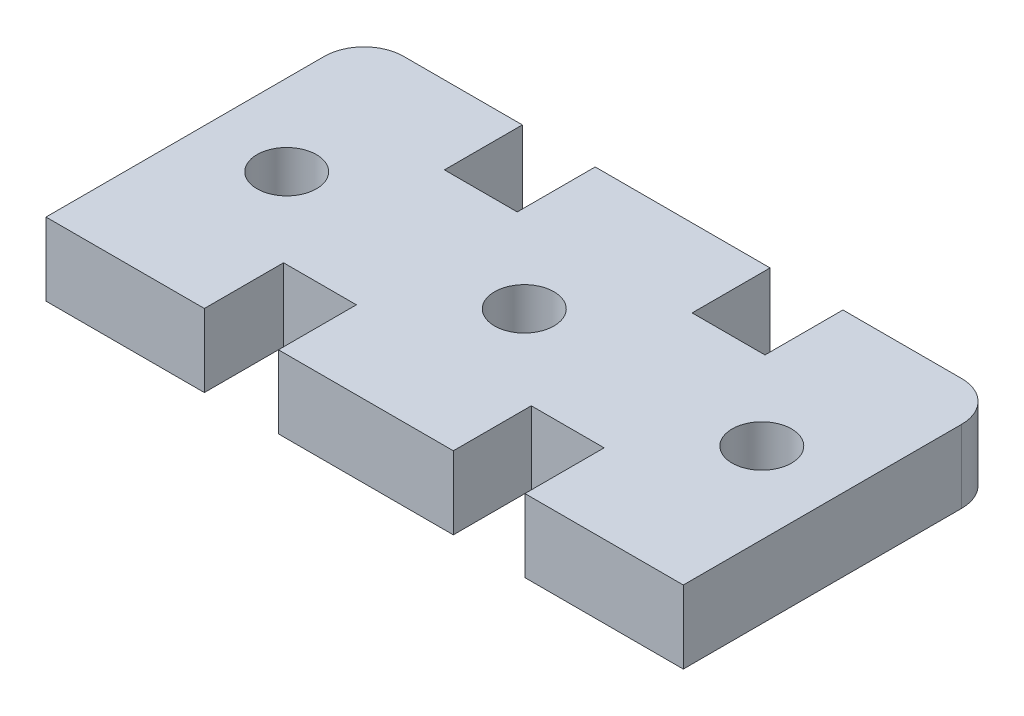
ISO-10303-21;
HEADER;
FILE_DESCRIPTION(('STEP AP214'),'2;1');
FILE_NAME('part.step','',(''),(''),'','','');
FILE_SCHEMA(('AUTOMOTIVE_DESIGN { 1 0 10303 214 1 1 1 1 }'));
ENDSEC;
DATA;
#1=APPLICATION_CONTEXT('core data for automotive mechanical design processes');
#2=APPLICATION_PROTOCOL_DEFINITION('international standard','automotive_design',2000,#1);
#3=PRODUCT_CONTEXT('',#1,'mechanical');
#4=PRODUCT('Part','Part','',(#3));
#5=PRODUCT_RELATED_PRODUCT_CATEGORY('part','',(#4));
#6=PRODUCT_DEFINITION_FORMATION('','',#4);
#7=PRODUCT_DEFINITION_CONTEXT('part definition',#1,'design');
#8=PRODUCT_DEFINITION('design','',#6,#7);
#9=PRODUCT_DEFINITION_SHAPE('','',#8);
#10=(LENGTH_UNIT() NAMED_UNIT(*) SI_UNIT(.MILLI.,.METRE.));
#11=(NAMED_UNIT(*) PLANE_ANGLE_UNIT() SI_UNIT($,.RADIAN.));
#12=(NAMED_UNIT(*) SI_UNIT($,.STERADIAN.) SOLID_ANGLE_UNIT());
#13=UNCERTAINTY_MEASURE_WITH_UNIT(LENGTH_MEASURE(1.E-05),#10,'distance_accuracy_value','');
#14=(GEOMETRIC_REPRESENTATION_CONTEXT(3) GLOBAL_UNCERTAINTY_ASSIGNED_CONTEXT((#13)) GLOBAL_UNIT_ASSIGNED_CONTEXT((#10,
#11,#12)) REPRESENTATION_CONTEXT('',''));
#15=CARTESIAN_POINT('',(0.,0.,0.));
#16=DIRECTION('',(0.,0.,1.));
#17=DIRECTION('',(1.,0.,0.));
#18=AXIS2_PLACEMENT_3D('',#15,#16,#17);
#19=CARTESIAN_POINT('',(-7.012,5.842,-6.44999999999999));
#20=DIRECTION('',(1.,0.,0.));
#21=DIRECTION('',(0.,0.,-1.));
#22=AXIS2_PLACEMENT_3D('',#19,#20,#21);
#23=PLANE('',#22);
#24=DIRECTION('',(0.,0.,1.));
#25=VECTOR('',#24,1.);
#26=CARTESIAN_POINT('',(-7.012,0.,-6.44999999999999));
#27=LINE('',#26,#25);
#28=CARTESIAN_POINT('',(-7.012,0.,-12.7));
#29=VERTEX_POINT('',#28);
#30=CARTESIAN_POINT('',(-7.012,0.,-6.44999999999999));
#31=VERTEX_POINT('',#30);
#32=EDGE_CURVE('E242',#29,#31,#27,.T.);
#33=ORIENTED_EDGE('',*,*,#32,.T.);
#34=DIRECTION('',(0.,-1.,0.));
#35=VECTOR('',#34,1.);
#36=CARTESIAN_POINT('',(-7.012,5.842,-6.44999999999999));
#37=LINE('',#36,#35);
#38=CARTESIAN_POINT('',(-7.012,5.842,-6.44999999999999));
#39=VERTEX_POINT('',#38);
#40=EDGE_CURVE('E352',#39,#31,#37,.T.);
#41=ORIENTED_EDGE('',*,*,#40,.F.);
#42=DIRECTION('',(0.,0.,1.));
#43=VECTOR('',#42,1.);
#44=CARTESIAN_POINT('',(-7.012,5.842,-6.44999999999999));
#45=LINE('',#44,#43);
#46=CARTESIAN_POINT('',(-7.012,5.842,-12.7));
#47=VERTEX_POINT('',#46);
#48=EDGE_CURVE('E245',#47,#39,#45,.T.);
#49=ORIENTED_EDGE('',*,*,#48,.F.);
#50=DIRECTION('',(0.,-1.,0.));
#51=VECTOR('',#50,1.);
#52=CARTESIAN_POINT('',(-7.012,5.842,-12.7));
#53=LINE('',#52,#51);
#54=EDGE_CURVE('E279',#47,#29,#53,.T.);
#55=ORIENTED_EDGE('',*,*,#54,.T.);
#56=EDGE_LOOP('',(#33,#41,#49,#55));
#57=FACE_BOUND('',#56,.T.);
#58=ADVANCED_FACE('F35',(#57),#23,.F.);
#59=CARTESIAN_POINT('',(-12.854,5.842,-6.44999999999999));
#60=DIRECTION('',(0.,0.,1.));
#61=DIRECTION('',(1.,0.,0.));
#62=AXIS2_PLACEMENT_3D('',#59,#60,#61);
#63=PLANE('',#62);
#64=DIRECTION('',(-1.,0.,0.));
#65=VECTOR('',#64,1.);
#66=CARTESIAN_POINT('',(-12.854,0.,-6.44999999999999));
#67=LINE('',#66,#65);
#68=CARTESIAN_POINT('',(-12.854,0.,-6.44999999999999));
#69=VERTEX_POINT('',#68);
#70=EDGE_CURVE('E282',#31,#69,#67,.T.);
#71=ORIENTED_EDGE('',*,*,#70,.T.);
#72=DIRECTION('',(0.,-1.,0.));
#73=VECTOR('',#72,1.);
#74=CARTESIAN_POINT('',(-12.854,5.842,-6.44999999999999));
#75=LINE('',#74,#73);
#76=CARTESIAN_POINT('',(-12.854,5.842,-6.44999999999999));
#77=VERTEX_POINT('',#76);
#78=EDGE_CURVE('E349',#77,#69,#75,.T.);
#79=ORIENTED_EDGE('',*,*,#78,.F.);
#80=DIRECTION('',(-1.,0.,0.));
#81=VECTOR('',#80,1.);
#82=CARTESIAN_POINT('',(-12.854,5.842,-6.44999999999999));
#83=LINE('',#82,#81);
#84=EDGE_CURVE('E248',#39,#77,#83,.T.);
#85=ORIENTED_EDGE('',*,*,#84,.F.);
#86=ORIENTED_EDGE('',*,*,#40,.T.);
#87=EDGE_LOOP('',(#71,#79,#85,#86));
#88=FACE_BOUND('',#87,.T.);
#89=ADVANCED_FACE('F447',(#88),#63,.F.);
#90=CARTESIAN_POINT('',(-12.854,5.842,-6.44999999999999));
#91=DIRECTION('',(-1.,0.,0.));
#92=DIRECTION('',(0.,0.,1.));
#93=AXIS2_PLACEMENT_3D('',#90,#91,#92);
#94=PLANE('',#93);
#95=DIRECTION('',(0.,0.,-1.));
#96=VECTOR('',#95,1.);
#97=CARTESIAN_POINT('',(-12.854,0.,-6.44999999999999));
#98=LINE('',#97,#96);
#99=CARTESIAN_POINT('',(-12.854,0.,-12.7));
#100=VERTEX_POINT('',#99);
#101=EDGE_CURVE('E284',#69,#100,#98,.T.);
#102=ORIENTED_EDGE('',*,*,#101,.T.);
#103=DIRECTION('',(0.,-1.,0.));
#104=VECTOR('',#103,1.);
#105=CARTESIAN_POINT('',(-12.854,5.842,-12.7));
#106=LINE('',#105,#104);
#107=CARTESIAN_POINT('',(-12.854,5.842,-12.7));
#108=VERTEX_POINT('',#107);
#109=EDGE_CURVE('E346',#108,#100,#106,.T.);
#110=ORIENTED_EDGE('',*,*,#109,.F.);
#111=DIRECTION('',(0.,0.,-1.));
#112=VECTOR('',#111,1.);
#113=CARTESIAN_POINT('',(-12.854,5.842,-6.44999999999999));
#114=LINE('',#113,#112);
#115=EDGE_CURVE('E251',#77,#108,#114,.T.);
#116=ORIENTED_EDGE('',*,*,#115,.F.);
#117=ORIENTED_EDGE('',*,*,#78,.T.);
#118=EDGE_LOOP('',(#102,#110,#116,#117));
#119=FACE_BOUND('',#118,.T.);
#120=ADVANCED_FACE('F450',(#119),#94,.F.);
#121=CARTESIAN_POINT('',(-25.554,5.842,-12.7));
#122=DIRECTION('',(0.,0.,1.));
#123=DIRECTION('',(1.,0.,0.));
#124=AXIS2_PLACEMENT_3D('',#121,#122,#123);
#125=PLANE('',#124);
#126=DIRECTION('',(-1.,0.,0.));
#127=VECTOR('',#126,1.);
#128=CARTESIAN_POINT('',(-25.554,0.,-12.7));
#129=LINE('',#128,#127);
#130=CARTESIAN_POINT('',(-22.379,0.,-12.7));
#131=VERTEX_POINT('',#130);
#132=EDGE_CURVE('E286',#100,#131,#129,.T.);
#133=ORIENTED_EDGE('',*,*,#132,.T.);
#134=DIRECTION('',(0.,-1.,0.));
#135=VECTOR('',#134,1.);
#136=CARTESIAN_POINT('',(-22.379,5.842,-12.7));
#137=LINE('',#136,#135);
#138=CARTESIAN_POINT('',(-22.379,5.842,-12.7));
#139=VERTEX_POINT('',#138);
#140=EDGE_CURVE('E11',#131,#139,#137,.F.);
#141=ORIENTED_EDGE('',*,*,#140,.T.);
#142=DIRECTION('',(-1.,0.,0.));
#143=VECTOR('',#142,1.);
#144=CARTESIAN_POINT('',(-25.554,5.842,-12.7));
#145=LINE('',#144,#143);
#146=EDGE_CURVE('E253',#108,#139,#145,.T.);
#147=ORIENTED_EDGE('',*,*,#146,.F.);
#148=ORIENTED_EDGE('',*,*,#109,.T.);
#149=EDGE_LOOP('',(#133,#141,#147,#148));
#150=FACE_BOUND('',#149,.T.);
#151=ADVANCED_FACE('F451',(#150),#125,.F.);
#152=CARTESIAN_POINT('',(-25.554,5.842,12.7));
#153=DIRECTION('',(1.,0.,0.));
#154=DIRECTION('',(0.,0.,-1.));
#155=AXIS2_PLACEMENT_3D('',#152,#153,#154);
#156=PLANE('',#155);
#157=DIRECTION('',(0.,0.,1.));
#158=VECTOR('',#157,1.);
#159=CARTESIAN_POINT('',(-25.554,5.842,12.7));
#160=LINE('',#159,#158);
#161=CARTESIAN_POINT('',(-25.554,5.842,-9.52499999999998));
#162=VERTEX_POINT('',#161);
#163=CARTESIAN_POINT('',(-25.554,5.842,12.8));
#164=VERTEX_POINT('',#163);
#165=EDGE_CURVE('E255',#162,#164,#160,.T.);
#166=ORIENTED_EDGE('',*,*,#165,.F.);
#167=DIRECTION('',(0.,-1.,0.));
#168=VECTOR('',#167,1.);
#169=CARTESIAN_POINT('',(-25.554,5.842,-9.52499999999998));
#170=LINE('',#169,#168);
#171=CARTESIAN_POINT('',(-25.554,0.,-9.52499999999998));
#172=VERTEX_POINT('',#171);
#173=EDGE_CURVE('E43',#162,#172,#170,.T.);
#174=ORIENTED_EDGE('',*,*,#173,.T.);
#175=DIRECTION('',(0.,0.,1.));
#176=VECTOR('',#175,1.);
#177=CARTESIAN_POINT('',(-25.554,0.,12.7));
#178=LINE('',#177,#176);
#179=CARTESIAN_POINT('',(-25.554,0.,12.8));
#180=VERTEX_POINT('',#179);
#181=EDGE_CURVE('E288',#172,#180,#178,.T.);
#182=ORIENTED_EDGE('',*,*,#181,.T.);
#183=DIRECTION('',(0.,1.,0.));
#184=VECTOR('',#183,1.);
#185=CARTESIAN_POINT('',(-25.554,-12.7003936946852,12.8));
#186=LINE('',#185,#184);
#187=EDGE_CURVE('E217',#180,#164,#186,.T.);
#188=ORIENTED_EDGE('',*,*,#187,.T.);
#189=EDGE_LOOP('',(#166,#174,#182,#188));
#190=FACE_BOUND('',#189,.T.);
#191=ADVANCED_FACE('F370',(#190),#156,.F.);
#192=CARTESIAN_POINT('',(-12.854,5.842,12.7));
#193=DIRECTION('',(-1.,0.,0.));
#194=DIRECTION('',(0.,0.,1.));
#195=AXIS2_PLACEMENT_3D('',#192,#193,#194);
#196=PLANE('',#195);
#197=DIRECTION('',(0.,0.,-1.));
#198=VECTOR('',#197,1.);
#199=CARTESIAN_POINT('',(-12.854,0.,12.7));
#200=LINE('',#199,#198);
#201=CARTESIAN_POINT('',(-12.854,0.,12.8));
#202=VERTEX_POINT('',#201);
#203=CARTESIAN_POINT('',(-12.854,0.,6.45000000000001));
#204=VERTEX_POINT('',#203);
#205=EDGE_CURVE('E290',#202,#204,#200,.T.);
#206=ORIENTED_EDGE('',*,*,#205,.T.);
#207=DIRECTION('',(0.,-1.,0.));
#208=VECTOR('',#207,1.);
#209=CARTESIAN_POINT('',(-12.854,5.842,6.45000000000001));
#210=LINE('',#209,#208);
#211=CARTESIAN_POINT('',(-12.854,5.842,6.45000000000001));
#212=VERTEX_POINT('',#211);
#213=EDGE_CURVE('E343',#212,#204,#210,.T.);
#214=ORIENTED_EDGE('',*,*,#213,.F.);
#215=DIRECTION('',(0.,0.,-1.));
#216=VECTOR('',#215,1.);
#217=CARTESIAN_POINT('',(-12.854,5.842,12.7));
#218=LINE('',#217,#216);
#219=CARTESIAN_POINT('',(-12.854,5.842,12.8));
#220=VERTEX_POINT('',#219);
#221=EDGE_CURVE('E257',#220,#212,#218,.T.);
#222=ORIENTED_EDGE('',*,*,#221,.F.);
#223=DIRECTION('',(0.,1.,0.));
#224=VECTOR('',#223,1.);
#225=CARTESIAN_POINT('',(-12.854,-12.7003936946852,12.8));
#226=LINE('',#225,#224);
#227=EDGE_CURVE('E218',#202,#220,#226,.T.);
#228=ORIENTED_EDGE('',*,*,#227,.F.);
#229=EDGE_LOOP('',(#206,#214,#222,#228));
#230=FACE_BOUND('',#229,.T.);
#231=ADVANCED_FACE('F387',(#230),#196,.F.);
#232=CARTESIAN_POINT('',(-12.854,5.842,6.45000000000001));
#233=DIRECTION('',(0.,0.,-1.));
#234=DIRECTION('',(-1.,0.,0.));
#235=AXIS2_PLACEMENT_3D('',#232,#233,#234);
#236=PLANE('',#235);
#237=DIRECTION('',(1.,0.,0.));
#238=VECTOR('',#237,1.);
#239=CARTESIAN_POINT('',(-12.854,0.,6.45000000000001));
#240=LINE('',#239,#238);
#241=CARTESIAN_POINT('',(-7.012,0.,6.45000000000001));
#242=VERTEX_POINT('',#241);
#243=EDGE_CURVE('E292',#204,#242,#240,.T.);
#244=ORIENTED_EDGE('',*,*,#243,.T.);
#245=DIRECTION('',(0.,-1.,0.));
#246=VECTOR('',#245,1.);
#247=CARTESIAN_POINT('',(-7.012,5.842,6.45000000000001));
#248=LINE('',#247,#246);
#249=CARTESIAN_POINT('',(-7.012,5.842,6.45000000000001));
#250=VERTEX_POINT('',#249);
#251=EDGE_CURVE('E340',#250,#242,#248,.T.);
#252=ORIENTED_EDGE('',*,*,#251,.F.);
#253=DIRECTION('',(1.,0.,0.));
#254=VECTOR('',#253,1.);
#255=CARTESIAN_POINT('',(-12.854,5.842,6.45000000000001));
#256=LINE('',#255,#254);
#257=EDGE_CURVE('E259',#212,#250,#256,.T.);
#258=ORIENTED_EDGE('',*,*,#257,.F.);
#259=ORIENTED_EDGE('',*,*,#213,.T.);
#260=EDGE_LOOP('',(#244,#252,#258,#259));
#261=FACE_BOUND('',#260,.T.);
#262=ADVANCED_FACE('F389',(#261),#236,.F.);
#263=CARTESIAN_POINT('',(-7.012,5.842,12.7));
#264=DIRECTION('',(1.,0.,0.));
#265=DIRECTION('',(0.,0.,-1.));
#266=AXIS2_PLACEMENT_3D('',#263,#264,#265);
#267=PLANE('',#266);
#268=DIRECTION('',(0.,0.,1.));
#269=VECTOR('',#268,1.);
#270=CARTESIAN_POINT('',(-7.012,0.,12.7));
#271=LINE('',#270,#269);
#272=CARTESIAN_POINT('',(-7.012,0.,12.7));
#273=VERTEX_POINT('',#272);
#274=EDGE_CURVE('E294',#242,#273,#271,.T.);
#275=ORIENTED_EDGE('',*,*,#274,.T.);
#276=DIRECTION('',(0.,-1.,0.));
#277=VECTOR('',#276,1.);
#278=CARTESIAN_POINT('',(-7.012,5.842,12.7));
#279=LINE('',#278,#277);
#280=CARTESIAN_POINT('',(-7.012,5.842,12.7));
#281=VERTEX_POINT('',#280);
#282=EDGE_CURVE('E337',#281,#273,#279,.T.);
#283=ORIENTED_EDGE('',*,*,#282,.F.);
#284=DIRECTION('',(0.,0.,1.));
#285=VECTOR('',#284,1.);
#286=CARTESIAN_POINT('',(-7.012,5.842,12.7));
#287=LINE('',#286,#285);
#288=EDGE_CURVE('E261',#250,#281,#287,.T.);
#289=ORIENTED_EDGE('',*,*,#288,.F.);
#290=ORIENTED_EDGE('',*,*,#251,.T.);
#291=EDGE_LOOP('',(#275,#283,#289,#290));
#292=FACE_BOUND('',#291,.T.);
#293=ADVANCED_FACE('F394',(#292),#267,.F.);
#294=CARTESIAN_POINT('',(7.012,5.842,12.7));
#295=DIRECTION('',(0.,0.,-1.));
#296=DIRECTION('',(-1.,0.,0.));
#297=AXIS2_PLACEMENT_3D('',#294,#295,#296);
#298=PLANE('',#297);
#299=DIRECTION('',(1.,0.,0.));
#300=VECTOR('',#299,1.);
#301=CARTESIAN_POINT('',(7.012,0.,12.7));
#302=LINE('',#301,#300);
#303=CARTESIAN_POINT('',(7.012,0.,12.7));
#304=VERTEX_POINT('',#303);
#305=EDGE_CURVE('E296',#273,#304,#302,.T.);
#306=ORIENTED_EDGE('',*,*,#305,.T.);
#307=DIRECTION('',(0.,-1.,0.));
#308=VECTOR('',#307,1.);
#309=CARTESIAN_POINT('',(7.012,5.842,12.7));
#310=LINE('',#309,#308);
#311=CARTESIAN_POINT('',(7.012,5.842,12.7));
#312=VERTEX_POINT('',#311);
#313=EDGE_CURVE('E334',#312,#304,#310,.T.);
#314=ORIENTED_EDGE('',*,*,#313,.F.);
#315=DIRECTION('',(1.,0.,0.));
#316=VECTOR('',#315,1.);
#317=CARTESIAN_POINT('',(7.012,5.842,12.7));
#318=LINE('',#317,#316);
#319=EDGE_CURVE('E263',#281,#312,#318,.T.);
#320=ORIENTED_EDGE('',*,*,#319,.F.);
#321=ORIENTED_EDGE('',*,*,#282,.T.);
#322=EDGE_LOOP('',(#306,#314,#320,#321));
#323=FACE_BOUND('',#322,.T.);
#324=ADVANCED_FACE('F400',(#323),#298,.F.);
#325=CARTESIAN_POINT('',(7.012,5.842,12.7));
#326=DIRECTION('',(-1.,0.,0.));
#327=DIRECTION('',(0.,0.,1.));
#328=AXIS2_PLACEMENT_3D('',#325,#326,#327);
#329=PLANE('',#328);
#330=DIRECTION('',(0.,0.,-1.));
#331=VECTOR('',#330,1.);
#332=CARTESIAN_POINT('',(7.012,0.,12.7));
#333=LINE('',#332,#331);
#334=CARTESIAN_POINT('',(7.012,0.,6.45000000000001));
#335=VERTEX_POINT('',#334);
#336=EDGE_CURVE('E298',#304,#335,#333,.T.);
#337=ORIENTED_EDGE('',*,*,#336,.T.);
#338=DIRECTION('',(0.,-1.,0.));
#339=VECTOR('',#338,1.);
#340=CARTESIAN_POINT('',(7.012,5.842,6.45000000000001));
#341=LINE('',#340,#339);
#342=CARTESIAN_POINT('',(7.012,5.842,6.45000000000001));
#343=VERTEX_POINT('',#342);
#344=EDGE_CURVE('E331',#343,#335,#341,.T.);
#345=ORIENTED_EDGE('',*,*,#344,.F.);
#346=DIRECTION('',(0.,0.,-1.));
#347=VECTOR('',#346,1.);
#348=CARTESIAN_POINT('',(7.012,5.842,12.7));
#349=LINE('',#348,#347);
#350=EDGE_CURVE('E265',#312,#343,#349,.T.);
#351=ORIENTED_EDGE('',*,*,#350,.F.);
#352=ORIENTED_EDGE('',*,*,#313,.T.);
#353=EDGE_LOOP('',(#337,#345,#351,#352));
#354=FACE_BOUND('',#353,.T.);
#355=ADVANCED_FACE('F404',(#354),#329,.F.);
#356=CARTESIAN_POINT('',(12.854,5.842,6.45000000000001));
#357=DIRECTION('',(0.,0.,-1.));
#358=DIRECTION('',(-1.,0.,0.));
#359=AXIS2_PLACEMENT_3D('',#356,#357,#358);
#360=PLANE('',#359);
#361=DIRECTION('',(1.,0.,0.));
#362=VECTOR('',#361,1.);
#363=CARTESIAN_POINT('',(12.854,0.,6.45000000000001));
#364=LINE('',#363,#362);
#365=CARTESIAN_POINT('',(12.854,0.,6.45000000000001));
#366=VERTEX_POINT('',#365);
#367=EDGE_CURVE('E300',#335,#366,#364,.T.);
#368=ORIENTED_EDGE('',*,*,#367,.T.);
#369=DIRECTION('',(0.,-1.,0.));
#370=VECTOR('',#369,1.);
#371=CARTESIAN_POINT('',(12.854,5.842,6.45000000000001));
#372=LINE('',#371,#370);
#373=CARTESIAN_POINT('',(12.854,5.842,6.45000000000001));
#374=VERTEX_POINT('',#373);
#375=EDGE_CURVE('E329',#374,#366,#372,.T.);
#376=ORIENTED_EDGE('',*,*,#375,.F.);
#377=DIRECTION('',(1.,0.,0.));
#378=VECTOR('',#377,1.);
#379=CARTESIAN_POINT('',(12.854,5.842,6.45000000000001));
#380=LINE('',#379,#378);
#381=EDGE_CURVE('E190',#343,#374,#380,.T.);
#382=ORIENTED_EDGE('',*,*,#381,.F.);
#383=ORIENTED_EDGE('',*,*,#344,.T.);
#384=EDGE_LOOP('',(#368,#376,#382,#383));
#385=FACE_BOUND('',#384,.T.);
#386=ADVANCED_FACE('F407',(#385),#360,.F.);
#387=CARTESIAN_POINT('',(12.854,5.842,12.7));
#388=DIRECTION('',(1.,0.,0.));
#389=DIRECTION('',(0.,0.,-1.));
#390=AXIS2_PLACEMENT_3D('',#387,#388,#389);
#391=PLANE('',#390);
#392=DIRECTION('',(0.,0.,1.));
#393=VECTOR('',#392,1.);
#394=CARTESIAN_POINT('',(12.854,0.,12.7));
#395=LINE('',#394,#393);
#396=CARTESIAN_POINT('',(12.854,0.,12.8));
#397=VERTEX_POINT('',#396);
#398=EDGE_CURVE('E200',#366,#397,#395,.T.);
#399=ORIENTED_EDGE('',*,*,#398,.T.);
#400=DIRECTION('',(0.,1.,0.));
#401=VECTOR('',#400,1.);
#402=CARTESIAN_POINT('',(12.854,-12.7003936946852,12.8));
#403=LINE('',#402,#401);
#404=CARTESIAN_POINT('',(12.854,5.842,12.8));
#405=VERTEX_POINT('',#404);
#406=EDGE_CURVE('E197',#397,#405,#403,.T.);
#407=ORIENTED_EDGE('',*,*,#406,.T.);
#408=DIRECTION('',(0.,0.,1.));
#409=VECTOR('',#408,1.);
#410=CARTESIAN_POINT('',(12.854,5.842,12.7));
#411=LINE('',#410,#409);
#412=EDGE_CURVE('E183',#374,#405,#411,.T.);
#413=ORIENTED_EDGE('',*,*,#412,.F.);
#414=ORIENTED_EDGE('',*,*,#375,.T.);
#415=EDGE_LOOP('',(#399,#407,#413,#414));
#416=FACE_BOUND('',#415,.T.);
#417=ADVANCED_FACE('F198',(#416),#391,.F.);
#418=CARTESIAN_POINT('',(25.554,5.842,12.7));
#419=DIRECTION('',(-1.,0.,0.));
#420=DIRECTION('',(0.,0.,1.));
#421=AXIS2_PLACEMENT_3D('',#418,#419,#420);
#422=PLANE('',#421);
#423=DIRECTION('',(0.,0.,-1.));
#424=VECTOR('',#423,1.);
#425=CARTESIAN_POINT('',(25.554,0.,12.7));
#426=LINE('',#425,#424);
#427=CARTESIAN_POINT('',(25.554,0.,12.8));
#428=VERTEX_POINT('',#427);
#429=CARTESIAN_POINT('',(25.554,0.,-9.52499999999998));
#430=VERTEX_POINT('',#429);
#431=EDGE_CURVE('E303',#428,#430,#426,.T.);
#432=ORIENTED_EDGE('',*,*,#431,.T.);
#433=DIRECTION('',(0.,-1.,0.));
#434=VECTOR('',#433,1.);
#435=CARTESIAN_POINT('',(25.554,5.842,-9.52499999999998));
#436=LINE('',#435,#434);
#437=CARTESIAN_POINT('',(25.554,5.842,-9.52499999999998));
#438=VERTEX_POINT('',#437);
#439=EDGE_CURVE('E362',#430,#438,#436,.F.);
#440=ORIENTED_EDGE('',*,*,#439,.T.);
#441=DIRECTION('',(0.,0.,-1.));
#442=VECTOR('',#441,1.);
#443=CARTESIAN_POINT('',(25.554,5.842,12.7));
#444=LINE('',#443,#442);
#445=CARTESIAN_POINT('',(25.554,5.842,12.8));
#446=VERTEX_POINT('',#445);
#447=EDGE_CURVE('E194',#446,#438,#444,.T.);
#448=ORIENTED_EDGE('',*,*,#447,.F.);
#449=DIRECTION('',(0.,1.,0.));
#450=VECTOR('',#449,1.);
#451=CARTESIAN_POINT('',(25.554,-12.7003936946852,12.8));
#452=LINE('',#451,#450);
#453=EDGE_CURVE('E204',#428,#446,#452,.T.);
#454=ORIENTED_EDGE('',*,*,#453,.F.);
#455=EDGE_LOOP('',(#432,#440,#448,#454));
#456=FACE_BOUND('',#455,.T.);
#457=ADVANCED_FACE('F409',(#456),#422,.F.);
#458=CARTESIAN_POINT('',(25.554,5.842,-12.7));
#459=DIRECTION('',(0.,0.,1.));
#460=DIRECTION('',(1.,0.,0.));
#461=AXIS2_PLACEMENT_3D('',#458,#459,#460);
#462=PLANE('',#461);
#463=DIRECTION('',(-1.,0.,0.));
#464=VECTOR('',#463,1.);
#465=CARTESIAN_POINT('',(25.554,5.842,-12.7));
#466=LINE('',#465,#464);
#467=CARTESIAN_POINT('',(22.379,5.842,-12.7));
#468=VERTEX_POINT('',#467);
#469=CARTESIAN_POINT('',(12.854,5.842,-12.7));
#470=VERTEX_POINT('',#469);
#471=EDGE_CURVE('E269',#468,#470,#466,.T.);
#472=ORIENTED_EDGE('',*,*,#471,.F.);
#473=DIRECTION('',(0.,-1.,0.));
#474=VECTOR('',#473,1.);
#475=CARTESIAN_POINT('',(22.379,5.842,-12.7));
#476=LINE('',#475,#474);
#477=CARTESIAN_POINT('',(22.379,0.,-12.7));
#478=VERTEX_POINT('',#477);
#479=EDGE_CURVE('E355',#468,#478,#476,.T.);
#480=ORIENTED_EDGE('',*,*,#479,.T.);
#481=DIRECTION('',(-1.,0.,0.));
#482=VECTOR('',#481,1.);
#483=CARTESIAN_POINT('',(25.554,0.,-12.7));
#484=LINE('',#483,#482);
#485=CARTESIAN_POINT('',(12.854,0.,-12.7));
#486=VERTEX_POINT('',#485);
#487=EDGE_CURVE('E306',#478,#486,#484,.T.);
#488=ORIENTED_EDGE('',*,*,#487,.T.);
#489=DIRECTION('',(0.,-1.,0.));
#490=VECTOR('',#489,1.);
#491=CARTESIAN_POINT('',(12.854,5.842,-12.7));
#492=LINE('',#491,#490);
#493=EDGE_CURVE('E326',#470,#486,#492,.T.);
#494=ORIENTED_EDGE('',*,*,#493,.F.);
#495=EDGE_LOOP('',(#472,#480,#488,#494));
#496=FACE_BOUND('',#495,.T.);
#497=ADVANCED_FACE('F417',(#496),#462,.F.);
#498=CARTESIAN_POINT('',(12.854,5.842,-6.44999999999999));
#499=DIRECTION('',(1.,0.,0.));
#500=DIRECTION('',(0.,0.,-1.));
#501=AXIS2_PLACEMENT_3D('',#498,#499,#500);
#502=PLANE('',#501);
#503=DIRECTION('',(0.,0.,1.));
#504=VECTOR('',#503,1.);
#505=CARTESIAN_POINT('',(12.854,0.,-6.44999999999999));
#506=LINE('',#505,#504);
#507=CARTESIAN_POINT('',(12.854,0.,-6.44999999999999));
#508=VERTEX_POINT('',#507);
#509=EDGE_CURVE('E308',#486,#508,#506,.T.);
#510=ORIENTED_EDGE('',*,*,#509,.T.);
#511=DIRECTION('',(0.,-1.,0.));
#512=VECTOR('',#511,1.);
#513=CARTESIAN_POINT('',(12.854,5.842,-6.44999999999999));
#514=LINE('',#513,#512);
#515=CARTESIAN_POINT('',(12.854,5.842,-6.44999999999999));
#516=VERTEX_POINT('',#515);
#517=EDGE_CURVE('E323',#516,#508,#514,.T.);
#518=ORIENTED_EDGE('',*,*,#517,.F.);
#519=DIRECTION('',(0.,0.,1.));
#520=VECTOR('',#519,1.);
#521=CARTESIAN_POINT('',(12.854,5.842,-6.44999999999999));
#522=LINE('',#521,#520);
#523=EDGE_CURVE('E271',#470,#516,#522,.T.);
#524=ORIENTED_EDGE('',*,*,#523,.F.);
#525=ORIENTED_EDGE('',*,*,#493,.T.);
#526=EDGE_LOOP('',(#510,#518,#524,#525));
#527=FACE_BOUND('',#526,.T.);
#528=ADVANCED_FACE('F424',(#527),#502,.F.);
#529=CARTESIAN_POINT('',(12.854,5.842,-6.44999999999999));
#530=DIRECTION('',(0.,0.,1.));
#531=DIRECTION('',(1.,0.,0.));
#532=AXIS2_PLACEMENT_3D('',#529,#530,#531);
#533=PLANE('',#532);
#534=DIRECTION('',(-1.,0.,0.));
#535=VECTOR('',#534,1.);
#536=CARTESIAN_POINT('',(12.854,0.,-6.44999999999999));
#537=LINE('',#536,#535);
#538=CARTESIAN_POINT('',(7.012,0.,-6.44999999999999));
#539=VERTEX_POINT('',#538);
#540=EDGE_CURVE('E310',#508,#539,#537,.T.);
#541=ORIENTED_EDGE('',*,*,#540,.T.);
#542=DIRECTION('',(0.,-1.,0.));
#543=VECTOR('',#542,1.);
#544=CARTESIAN_POINT('',(7.012,5.842,-6.44999999999999));
#545=LINE('',#544,#543);
#546=CARTESIAN_POINT('',(7.012,5.842,-6.44999999999999));
#547=VERTEX_POINT('',#546);
#548=EDGE_CURVE('E320',#547,#539,#545,.T.);
#549=ORIENTED_EDGE('',*,*,#548,.F.);
#550=DIRECTION('',(-1.,0.,0.));
#551=VECTOR('',#550,1.);
#552=CARTESIAN_POINT('',(12.854,5.842,-6.44999999999999));
#553=LINE('',#552,#551);
#554=EDGE_CURVE('E273',#516,#547,#553,.T.);
#555=ORIENTED_EDGE('',*,*,#554,.F.);
#556=ORIENTED_EDGE('',*,*,#517,.T.);
#557=EDGE_LOOP('',(#541,#549,#555,#556));
#558=FACE_BOUND('',#557,.T.);
#559=ADVANCED_FACE('F428',(#558),#533,.F.);
#560=CARTESIAN_POINT('',(7.012,5.842,-6.44999999999999));
#561=DIRECTION('',(-1.,0.,0.));
#562=DIRECTION('',(0.,0.,1.));
#563=AXIS2_PLACEMENT_3D('',#560,#561,#562);
#564=PLANE('',#563);
#565=DIRECTION('',(0.,0.,-1.));
#566=VECTOR('',#565,1.);
#567=CARTESIAN_POINT('',(7.012,0.,-6.44999999999999));
#568=LINE('',#567,#566);
#569=CARTESIAN_POINT('',(7.012,0.,-12.7));
#570=VERTEX_POINT('',#569);
#571=EDGE_CURVE('E312',#539,#570,#568,.T.);
#572=ORIENTED_EDGE('',*,*,#571,.T.);
#573=DIRECTION('',(0.,-1.,0.));
#574=VECTOR('',#573,1.);
#575=CARTESIAN_POINT('',(7.012,5.842,-12.7));
#576=LINE('',#575,#574);
#577=CARTESIAN_POINT('',(7.012,5.842,-12.7));
#578=VERTEX_POINT('',#577);
#579=EDGE_CURVE('E317',#578,#570,#576,.T.);
#580=ORIENTED_EDGE('',*,*,#579,.F.);
#581=DIRECTION('',(0.,0.,-1.));
#582=VECTOR('',#581,1.);
#583=CARTESIAN_POINT('',(7.012,5.842,-6.44999999999999));
#584=LINE('',#583,#582);
#585=EDGE_CURVE('E275',#547,#578,#584,.T.);
#586=ORIENTED_EDGE('',*,*,#585,.F.);
#587=ORIENTED_EDGE('',*,*,#548,.T.);
#588=EDGE_LOOP('',(#572,#580,#586,#587));
#589=FACE_BOUND('',#588,.T.);
#590=ADVANCED_FACE('F435',(#589),#564,.F.);
#591=CARTESIAN_POINT('',(7.012,5.842,-12.7));
#592=DIRECTION('',(0.,0.,1.));
#593=DIRECTION('',(1.,0.,0.));
#594=AXIS2_PLACEMENT_3D('',#591,#592,#593);
#595=PLANE('',#594);
#596=DIRECTION('',(-1.,0.,0.));
#597=VECTOR('',#596,1.);
#598=CARTESIAN_POINT('',(7.012,0.,-12.7));
#599=LINE('',#598,#597);
#600=EDGE_CURVE('E249',#570,#29,#599,.T.);
#601=ORIENTED_EDGE('',*,*,#600,.T.);
#602=ORIENTED_EDGE('',*,*,#54,.F.);
#603=DIRECTION('',(-1.,0.,0.));
#604=VECTOR('',#603,1.);
#605=CARTESIAN_POINT('',(7.012,5.842,-12.7));
#606=LINE('',#605,#604);
#607=EDGE_CURVE('E277',#578,#47,#606,.T.);
#608=ORIENTED_EDGE('',*,*,#607,.F.);
#609=ORIENTED_EDGE('',*,*,#579,.T.);
#610=EDGE_LOOP('',(#601,#602,#608,#609));
#611=FACE_BOUND('',#610,.T.);
#612=ADVANCED_FACE('F438',(#611),#595,.F.);
#613=CARTESIAN_POINT('',(0.,5.842,0.));
#614=DIRECTION('',(0.,1.,0.));
#615=DIRECTION('',(0.,0.,1.));
#616=AXIS2_PLACEMENT_3D('',#613,#614,#615);
#617=PLANE('',#616);
#618=CARTESIAN_POINT('',(19.05,5.842,0.));
#619=DIRECTION('',(0.,1.,0.));
#620=DIRECTION('',(0.,0.,-1.));
#621=AXIS2_PLACEMENT_3D('',#618,#619,#620);
#622=CIRCLE('',#621,2.38125);
#623=CARTESIAN_POINT('',(19.05,5.842,-2.38125));
#624=VERTEX_POINT('',#623);
#625=EDGE_CURVE('E226',#624,#624,#622,.T.);
#626=ORIENTED_EDGE('',*,*,#625,.F.);
#627=EDGE_LOOP('',(#626));
#628=FACE_BOUND('',#627,.T.);
#629=CARTESIAN_POINT('',(-19.05,5.842,0.));
#630=DIRECTION('',(0.,1.,0.));
#631=DIRECTION('',(0.,0.,1.));
#632=AXIS2_PLACEMENT_3D('',#629,#630,#631);
#633=CIRCLE('',#632,2.38125);
#634=CARTESIAN_POINT('',(-19.05,5.842,2.38125000000001));
#635=VERTEX_POINT('',#634);
#636=EDGE_CURVE('E230',#635,#635,#633,.T.);
#637=ORIENTED_EDGE('',*,*,#636,.F.);
#638=EDGE_LOOP('',(#637));
#639=FACE_BOUND('',#638,.T.);
#640=CARTESIAN_POINT('',(0.,5.842,0.));
#641=DIRECTION('',(0.,1.,0.));
#642=DIRECTION('',(0.,0.,1.));
#643=AXIS2_PLACEMENT_3D('',#640,#641,#642);
#644=CIRCLE('',#643,2.38125);
#645=CARTESIAN_POINT('',(0.,5.842,2.38125000000001));
#646=VERTEX_POINT('',#645);
#647=EDGE_CURVE('E236',#646,#646,#644,.T.);
#648=ORIENTED_EDGE('',*,*,#647,.F.);
#649=EDGE_LOOP('',(#648));
#650=FACE_BOUND('',#649,.T.);
#651=ORIENTED_EDGE('',*,*,#447,.T.);
#652=CARTESIAN_POINT('',(22.379,5.842,-9.52499999999998));
#653=DIRECTION('',(0.,1.,0.));
#654=DIRECTION('',(0.,0.,1.));
#655=AXIS2_PLACEMENT_3D('',#652,#653,#654);
#656=CIRCLE('',#655,3.175);
#657=EDGE_CURVE('E365',#438,#468,#656,.T.);
#658=ORIENTED_EDGE('',*,*,#657,.T.);
#659=ORIENTED_EDGE('',*,*,#471,.T.);
#660=ORIENTED_EDGE('',*,*,#523,.T.);
#661=ORIENTED_EDGE('',*,*,#554,.T.);
#662=ORIENTED_EDGE('',*,*,#585,.T.);
#663=ORIENTED_EDGE('',*,*,#607,.T.);
#664=ORIENTED_EDGE('',*,*,#48,.T.);
#665=ORIENTED_EDGE('',*,*,#84,.T.);
#666=ORIENTED_EDGE('',*,*,#115,.T.);
#667=ORIENTED_EDGE('',*,*,#146,.T.);
#668=CARTESIAN_POINT('',(-22.379,5.842,-9.52499999999998));
#669=DIRECTION('',(0.,1.,0.));
#670=DIRECTION('',(0.,0.,1.));
#671=AXIS2_PLACEMENT_3D('',#668,#669,#670);
#672=CIRCLE('',#671,3.175);
#673=EDGE_CURVE('E50',#139,#162,#672,.T.);
#674=ORIENTED_EDGE('',*,*,#673,.T.);
#675=ORIENTED_EDGE('',*,*,#165,.T.);
#676=DIRECTION('',(1.,0.,0.));
#677=VECTOR('',#676,1.);
#678=CARTESIAN_POINT('',(-25.554,5.842,12.8));
#679=LINE('',#678,#677);
#680=EDGE_CURVE('E214',#164,#220,#679,.T.);
#681=ORIENTED_EDGE('',*,*,#680,.T.);
#682=ORIENTED_EDGE('',*,*,#221,.T.);
#683=ORIENTED_EDGE('',*,*,#257,.T.);
#684=ORIENTED_EDGE('',*,*,#288,.T.);
#685=ORIENTED_EDGE('',*,*,#319,.T.);
#686=ORIENTED_EDGE('',*,*,#350,.T.);
#687=ORIENTED_EDGE('',*,*,#381,.T.);
#688=ORIENTED_EDGE('',*,*,#412,.T.);
#689=DIRECTION('',(1.,0.,0.));
#690=VECTOR('',#689,1.);
#691=CARTESIAN_POINT('',(25.554,5.842,12.8));
#692=LINE('',#691,#690);
#693=EDGE_CURVE('E188',#405,#446,#692,.T.);
#694=ORIENTED_EDGE('',*,*,#693,.T.);
#695=EDGE_LOOP('',(#651,#658,#659,#660,#661,#662,#663,#664,#665,#666,#667,#674,#675,#681,#682,
#683,#684,#685,#686,#687,#688,#694));
#696=FACE_BOUND('',#695,.T.);
#697=ADVANCED_FACE('F186',(#628,#639,#650,#696),#617,.T.);
#698=CARTESIAN_POINT('',(0.,0.,0.));
#699=DIRECTION('',(0.,1.,0.));
#700=DIRECTION('',(0.,0.,1.));
#701=AXIS2_PLACEMENT_3D('',#698,#699,#700);
#702=PLANE('',#701);
#703=CARTESIAN_POINT('',(19.05,0.,0.));
#704=DIRECTION('',(0.,1.,0.));
#705=DIRECTION('',(0.,0.,-1.));
#706=AXIS2_PLACEMENT_3D('',#703,#704,#705);
#707=CIRCLE('',#706,2.38125);
#708=CARTESIAN_POINT('',(19.05,0.,-2.38125));
#709=VERTEX_POINT('',#708);
#710=EDGE_CURVE('E227',#709,#709,#707,.T.);
#711=ORIENTED_EDGE('',*,*,#710,.T.);
#712=EDGE_LOOP('',(#711));
#713=FACE_BOUND('',#712,.T.);
#714=CARTESIAN_POINT('',(-19.05,0.,0.));
#715=DIRECTION('',(0.,1.,0.));
#716=DIRECTION('',(0.,0.,1.));
#717=AXIS2_PLACEMENT_3D('',#714,#715,#716);
#718=CIRCLE('',#717,2.38125);
#719=CARTESIAN_POINT('',(-19.05,0.,2.38125000000001));
#720=VERTEX_POINT('',#719);
#721=EDGE_CURVE('E233',#720,#720,#718,.T.);
#722=ORIENTED_EDGE('',*,*,#721,.T.);
#723=EDGE_LOOP('',(#722));
#724=FACE_BOUND('',#723,.T.);
#725=CARTESIAN_POINT('',(0.,0.,0.));
#726=DIRECTION('',(0.,1.,0.));
#727=DIRECTION('',(0.,0.,1.));
#728=AXIS2_PLACEMENT_3D('',#725,#726,#727);
#729=CIRCLE('',#728,2.38125);
#730=CARTESIAN_POINT('',(0.,0.,2.38125000000001));
#731=VERTEX_POINT('',#730);
#732=EDGE_CURVE('E239',#731,#731,#729,.T.);
#733=ORIENTED_EDGE('',*,*,#732,.T.);
#734=EDGE_LOOP('',(#733));
#735=FACE_BOUND('',#734,.T.);
#736=ORIENTED_EDGE('',*,*,#487,.F.);
#737=CARTESIAN_POINT('',(22.379,0.,-9.52499999999998));
#738=DIRECTION('',(0.,1.,0.));
#739=DIRECTION('',(0.,0.,1.));
#740=AXIS2_PLACEMENT_3D('',#737,#738,#739);
#741=CIRCLE('',#740,3.175);
#742=EDGE_CURVE('E360',#478,#430,#741,.F.);
#743=ORIENTED_EDGE('',*,*,#742,.T.);
#744=ORIENTED_EDGE('',*,*,#431,.F.);
#745=DIRECTION('',(-1.,0.,0.));
#746=VECTOR('',#745,1.);
#747=CARTESIAN_POINT('',(25.554,0.,12.8));
#748=LINE('',#747,#746);
#749=EDGE_CURVE('E212',#428,#397,#748,.T.);
#750=ORIENTED_EDGE('',*,*,#749,.T.);
#751=ORIENTED_EDGE('',*,*,#398,.F.);
#752=ORIENTED_EDGE('',*,*,#367,.F.);
#753=ORIENTED_EDGE('',*,*,#336,.F.);
#754=ORIENTED_EDGE('',*,*,#305,.F.);
#755=ORIENTED_EDGE('',*,*,#274,.F.);
#756=ORIENTED_EDGE('',*,*,#243,.F.);
#757=ORIENTED_EDGE('',*,*,#205,.F.);
#758=DIRECTION('',(-1.,0.,0.));
#759=VECTOR('',#758,1.);
#760=CARTESIAN_POINT('',(-25.554,0.,12.8));
#761=LINE('',#760,#759);
#762=EDGE_CURVE('E221',#202,#180,#761,.T.);
#763=ORIENTED_EDGE('',*,*,#762,.T.);
#764=ORIENTED_EDGE('',*,*,#181,.F.);
#765=CARTESIAN_POINT('',(-22.379,0.,-9.52499999999998));
#766=DIRECTION('',(0.,1.,0.));
#767=DIRECTION('',(0.,0.,1.));
#768=AXIS2_PLACEMENT_3D('',#765,#766,#767);
#769=CIRCLE('',#768,3.175);
#770=EDGE_CURVE('E358',#172,#131,#769,.F.);
#771=ORIENTED_EDGE('',*,*,#770,.T.);
#772=ORIENTED_EDGE('',*,*,#132,.F.);
#773=ORIENTED_EDGE('',*,*,#101,.F.);
#774=ORIENTED_EDGE('',*,*,#70,.F.);
#775=ORIENTED_EDGE('',*,*,#32,.F.);
#776=ORIENTED_EDGE('',*,*,#600,.F.);
#777=ORIENTED_EDGE('',*,*,#571,.F.);
#778=ORIENTED_EDGE('',*,*,#540,.F.);
#779=ORIENTED_EDGE('',*,*,#509,.F.);
#780=EDGE_LOOP('',(#736,#743,#744,#750,#751,#752,#753,#754,#755,#756,#757,#763,#764,#771,#772,
#773,#774,#775,#776,#777,#778,#779));
#781=FACE_BOUND('',#780,.T.);
#782=ADVANCED_FACE('F374',(#713,#724,#735,#781),#702,.F.);
#783=CARTESIAN_POINT('',(0.,0.,0.));
#784=DIRECTION('',(0.,1.,0.));
#785=DIRECTION('',(0.,0.,1.));
#786=AXIS2_PLACEMENT_3D('',#783,#784,#785);
#787=CYLINDRICAL_SURFACE('',#786,2.38125);
#788=ORIENTED_EDGE('',*,*,#732,.F.);
#789=EDGE_LOOP('',(#788));
#790=FACE_BOUND('',#789,.T.);
#791=ORIENTED_EDGE('',*,*,#647,.T.);
#792=EDGE_LOOP('',(#791));
#793=FACE_BOUND('',#792,.T.);
#794=ADVANCED_FACE('F500',(#790,#793),#787,.F.);
#795=CARTESIAN_POINT('',(-19.05,0.,0.));
#796=DIRECTION('',(0.,1.,0.));
#797=DIRECTION('',(0.,0.,1.));
#798=AXIS2_PLACEMENT_3D('',#795,#796,#797);
#799=CYLINDRICAL_SURFACE('',#798,2.38125);
#800=ORIENTED_EDGE('',*,*,#721,.F.);
#801=EDGE_LOOP('',(#800));
#802=FACE_BOUND('',#801,.T.);
#803=ORIENTED_EDGE('',*,*,#636,.T.);
#804=EDGE_LOOP('',(#803));
#805=FACE_BOUND('',#804,.T.);
#806=ADVANCED_FACE('F507',(#802,#805),#799,.F.);
#807=CARTESIAN_POINT('',(19.05,0.,0.));
#808=DIRECTION('',(0.,1.,0.));
#809=DIRECTION('',(0.,0.,1.));
#810=AXIS2_PLACEMENT_3D('',#807,#808,#809);
#811=CYLINDRICAL_SURFACE('',#810,2.38125);
#812=ORIENTED_EDGE('',*,*,#710,.F.);
#813=EDGE_LOOP('',(#812));
#814=FACE_BOUND('',#813,.T.);
#815=ORIENTED_EDGE('',*,*,#625,.T.);
#816=EDGE_LOOP('',(#815));
#817=FACE_BOUND('',#816,.T.);
#818=ADVANCED_FACE('F458',(#814,#817),#811,.F.);
#819=CARTESIAN_POINT('',(22.379,5.842,-9.52499999999998));
#820=DIRECTION('',(0.,-1.,0.));
#821=DIRECTION('',(0.,0.,-1.));
#822=AXIS2_PLACEMENT_3D('',#819,#820,#821);
#823=CYLINDRICAL_SURFACE('',#822,3.175);
#824=ORIENTED_EDGE('',*,*,#657,.F.);
#825=ORIENTED_EDGE('',*,*,#439,.F.);
#826=ORIENTED_EDGE('',*,*,#742,.F.);
#827=ORIENTED_EDGE('',*,*,#479,.F.);
#828=EDGE_LOOP('',(#824,#825,#826,#827));
#829=FACE_BOUND('',#828,.T.);
#830=ADVANCED_FACE('F415',(#829),#823,.T.);
#831=CARTESIAN_POINT('',(-22.379,5.842,-9.52499999999998));
#832=DIRECTION('',(0.,-1.,0.));
#833=DIRECTION('',(0.,0.,-1.));
#834=AXIS2_PLACEMENT_3D('',#831,#832,#833);
#835=CYLINDRICAL_SURFACE('',#834,3.175);
#836=ORIENTED_EDGE('',*,*,#673,.F.);
#837=ORIENTED_EDGE('',*,*,#140,.F.);
#838=ORIENTED_EDGE('',*,*,#770,.F.);
#839=ORIENTED_EDGE('',*,*,#173,.F.);
#840=EDGE_LOOP('',(#836,#837,#838,#839));
#841=FACE_BOUND('',#840,.T.);
#842=ADVANCED_FACE('F37',(#841),#835,.T.);
#843=CARTESIAN_POINT('',(-25.554,-12.7003936946852,12.8));
#844=DIRECTION('',(0.,0.,1.));
#845=DIRECTION('',(1.,0.,0.));
#846=AXIS2_PLACEMENT_3D('',#843,#844,#845);
#847=PLANE('',#846);
#848=ORIENTED_EDGE('',*,*,#762,.F.);
#849=ORIENTED_EDGE('',*,*,#227,.T.);
#850=ORIENTED_EDGE('',*,*,#680,.F.);
#851=ORIENTED_EDGE('',*,*,#187,.F.);
#852=EDGE_LOOP('',(#848,#849,#850,#851));
#853=FACE_BOUND('',#852,.T.);
#854=ADVANCED_FACE('F382',(#853),#847,.T.);
#855=CARTESIAN_POINT('',(25.554,-12.7003936946852,12.8));
#856=DIRECTION('',(0.,0.,1.));
#857=DIRECTION('',(1.,0.,0.));
#858=AXIS2_PLACEMENT_3D('',#855,#856,#857);
#859=PLANE('',#858);
#860=ORIENTED_EDGE('',*,*,#749,.F.);
#861=ORIENTED_EDGE('',*,*,#453,.T.);
#862=ORIENTED_EDGE('',*,*,#693,.F.);
#863=ORIENTED_EDGE('',*,*,#406,.F.);
#864=EDGE_LOOP('',(#860,#861,#862,#863));
#865=FACE_BOUND('',#864,.T.);
#866=ADVANCED_FACE('F207',(#865),#859,.T.);
#867=CLOSED_SHELL('',(#58,#89,#120,#151,#191,#231,#262,#293,#324,#355,#386,#417,#457,#497,#528,
#559,#590,#612,#697,#782,#794,#806,#818,#830,#842,#854,#866));
#868=MANIFOLD_SOLID_BREP('B2',#867);
#869=ADVANCED_BREP_SHAPE_REPRESENTATION('',(#18,#868),#14);
#870=SHAPE_DEFINITION_REPRESENTATION(#9,#869);
ENDSEC;
END-ISO-10303-21;
